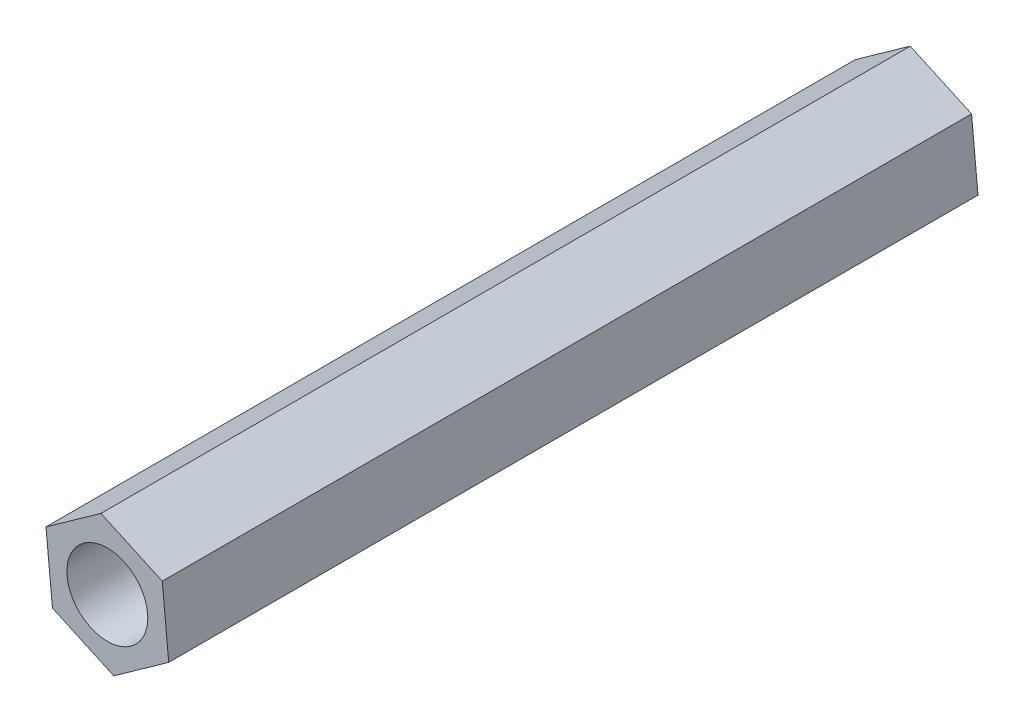
ISO-10303-21;
HEADER;
FILE_DESCRIPTION(('STEP AP214'),'2;1');
FILE_NAME('part.step','',(''),(''),'','','');
FILE_SCHEMA(('AUTOMOTIVE_DESIGN { 1 0 10303 214 1 1 1 1 }'));
ENDSEC;
DATA;
#1=APPLICATION_CONTEXT('core data for automotive mechanical design processes');
#2=APPLICATION_PROTOCOL_DEFINITION('international standard','automotive_design',2000,#1);
#3=PRODUCT_CONTEXT('',#1,'mechanical');
#4=PRODUCT('Part','Part','',(#3));
#5=PRODUCT_RELATED_PRODUCT_CATEGORY('part','',(#4));
#6=PRODUCT_DEFINITION_FORMATION('','',#4);
#7=PRODUCT_DEFINITION_CONTEXT('part definition',#1,'design');
#8=PRODUCT_DEFINITION('design','',#6,#7);
#9=PRODUCT_DEFINITION_SHAPE('','',#8);
#10=(LENGTH_UNIT() NAMED_UNIT(*) SI_UNIT(.MILLI.,.METRE.));
#11=(NAMED_UNIT(*) PLANE_ANGLE_UNIT() SI_UNIT($,.RADIAN.));
#12=(NAMED_UNIT(*) SI_UNIT($,.STERADIAN.) SOLID_ANGLE_UNIT());
#13=UNCERTAINTY_MEASURE_WITH_UNIT(LENGTH_MEASURE(1.E-05),#10,'distance_accuracy_value','');
#14=(GEOMETRIC_REPRESENTATION_CONTEXT(3) GLOBAL_UNCERTAINTY_ASSIGNED_CONTEXT((#13)) GLOBAL_UNIT_ASSIGNED_CONTEXT((#10,
#11,#12)) REPRESENTATION_CONTEXT('',''));
#15=CARTESIAN_POINT('',(0.,0.,0.));
#16=DIRECTION('',(0.,0.,1.));
#17=DIRECTION('',(1.,0.,0.));
#18=AXIS2_PLACEMENT_3D('',#15,#16,#17);
#19=CARTESIAN_POINT('',(0.,0.,30.));
#20=DIRECTION('',(0.,0.,1.));
#21=DIRECTION('',(1.,0.,0.));
#22=AXIS2_PLACEMENT_3D('',#19,#20,#21);
#23=PLANE('',#22);
#24=DIRECTION('',(-0.0950721836324173,0.995470381226566,0.));
#25=VECTOR('',#24,1.);
#26=CARTESIAN_POINT('',(2.27409682668349,-1.03850066098588,30.));
#27=LINE('',#26,#25);
#28=CARTESIAN_POINT('',(2.27409682668349,-1.03850066098588,30.));
#29=VERTEX_POINT('',#28);
#30=CARTESIAN_POINT('',(2.03641636760244,1.45017529208054,30.));
#31=VERTEX_POINT('',#30);
#32=EDGE_CURVE('E146',#29,#31,#27,.T.);
#33=ORIENTED_EDGE('',*,*,#32,.T.);
#34=DIRECTION('',(-0.909638730673394,0.41540026439435,0.));
#35=VECTOR('',#34,1.);
#36=CARTESIAN_POINT('',(2.03641636760244,1.45017529208054,30.));
#37=LINE('',#36,#35);
#38=CARTESIAN_POINT('',(-0.237680459081043,2.48867595306641,30.));
#39=VERTEX_POINT('',#38);
#40=EDGE_CURVE('E94',#31,#39,#37,.T.);
#41=ORIENTED_EDGE('',*,*,#40,.T.);
#42=DIRECTION('',(-0.814566547040977,-0.580070116832216,0.));
#43=VECTOR('',#42,1.);
#44=CARTESIAN_POINT('',(-0.237680459081043,2.48867595306641,30.));
#45=LINE('',#44,#43);
#46=CARTESIAN_POINT('',(-2.27409682668349,1.03850066098588,30.));
#47=VERTEX_POINT('',#46);
#48=EDGE_CURVE('E107',#39,#47,#45,.T.);
#49=ORIENTED_EDGE('',*,*,#48,.T.);
#50=DIRECTION('',(0.0950721836324175,-0.995470381226566,0.));
#51=VECTOR('',#50,1.);
#52=CARTESIAN_POINT('',(-2.27409682668349,1.03850066098588,30.));
#53=LINE('',#52,#51);
#54=CARTESIAN_POINT('',(-2.03641636760244,-1.45017529208054,30.));
#55=VERTEX_POINT('',#54);
#56=EDGE_CURVE('E101',#47,#55,#53,.T.);
#57=ORIENTED_EDGE('',*,*,#56,.T.);
#58=DIRECTION('',(0.909638730673394,-0.41540026439435,0.));
#59=VECTOR('',#58,1.);
#60=CARTESIAN_POINT('',(-2.03641636760244,-1.45017529208054,30.));
#61=LINE('',#60,#59);
#62=CARTESIAN_POINT('',(0.237680459081043,-2.48867595306641,30.));
#63=VERTEX_POINT('',#62);
#64=EDGE_CURVE('E105',#55,#63,#61,.T.);
#65=ORIENTED_EDGE('',*,*,#64,.T.);
#66=DIRECTION('',(0.814566547040977,0.580070116832215,0.));
#67=VECTOR('',#66,1.);
#68=CARTESIAN_POINT('',(0.237680459081043,-2.48867595306641,30.));
#69=LINE('',#68,#67);
#70=EDGE_CURVE('E57',#63,#29,#69,.T.);
#71=ORIENTED_EDGE('',*,*,#70,.T.);
#72=EDGE_LOOP('',(#33,#41,#49,#57,#65,#71));
#73=FACE_BOUND('',#72,.T.);
#74=CARTESIAN_POINT('',(0.,0.,30.));
#75=DIRECTION('',(0.,0.,1.));
#76=DIRECTION('',(1.,0.,0.));
#77=AXIS2_PLACEMENT_3D('',#74,#75,#76);
#78=CIRCLE('',#77,1.5);
#79=CARTESIAN_POINT('',(1.5,0.,30.));
#80=VERTEX_POINT('',#79);
#81=EDGE_CURVE('E134',#80,#80,#78,.T.);
#82=ORIENTED_EDGE('',*,*,#81,.F.);
#83=EDGE_LOOP('',(#82));
#84=FACE_BOUND('',#83,.T.);
#85=ADVANCED_FACE('F39',(#73,#84),#23,.T.);
#86=CARTESIAN_POINT('',(0.,0.,0.));
#87=DIRECTION('',(0.,0.,1.));
#88=DIRECTION('',(1.,0.,0.));
#89=AXIS2_PLACEMENT_3D('',#86,#87,#88);
#90=PLANE('',#89);
#91=DIRECTION('',(-0.0950721836324173,0.995470381226566,0.));
#92=VECTOR('',#91,1.);
#93=CARTESIAN_POINT('',(2.27409682668349,-1.03850066098588,0.));
#94=LINE('',#93,#92);
#95=CARTESIAN_POINT('',(2.27409682668349,-1.03850066098588,0.));
#96=VERTEX_POINT('',#95);
#97=CARTESIAN_POINT('',(2.03641636760244,1.45017529208054,0.));
#98=VERTEX_POINT('',#97);
#99=EDGE_CURVE('E129',#96,#98,#94,.T.);
#100=ORIENTED_EDGE('',*,*,#99,.F.);
#101=DIRECTION('',(0.814566547040977,0.580070116832215,0.));
#102=VECTOR('',#101,1.);
#103=CARTESIAN_POINT('',(0.237680459081043,-2.48867595306641,0.));
#104=LINE('',#103,#102);
#105=CARTESIAN_POINT('',(0.237680459081043,-2.48867595306641,0.));
#106=VERTEX_POINT('',#105);
#107=EDGE_CURVE('E86',#106,#96,#104,.T.);
#108=ORIENTED_EDGE('',*,*,#107,.F.);
#109=DIRECTION('',(0.909638730673394,-0.41540026439435,0.));
#110=VECTOR('',#109,1.);
#111=CARTESIAN_POINT('',(-2.03641636760244,-1.45017529208054,0.));
#112=LINE('',#111,#110);
#113=CARTESIAN_POINT('',(-2.03641636760244,-1.45017529208054,0.));
#114=VERTEX_POINT('',#113);
#115=EDGE_CURVE('E80',#114,#106,#112,.T.);
#116=ORIENTED_EDGE('',*,*,#115,.F.);
#117=DIRECTION('',(0.0950721836324175,-0.995470381226566,0.));
#118=VECTOR('',#117,1.);
#119=CARTESIAN_POINT('',(-2.27409682668349,1.03850066098588,0.));
#120=LINE('',#119,#118);
#121=CARTESIAN_POINT('',(-2.27409682668349,1.03850066098588,0.));
#122=VERTEX_POINT('',#121);
#123=EDGE_CURVE('E116',#122,#114,#120,.T.);
#124=ORIENTED_EDGE('',*,*,#123,.F.);
#125=DIRECTION('',(-0.814566547040977,-0.580070116832216,0.));
#126=VECTOR('',#125,1.);
#127=CARTESIAN_POINT('',(-0.237680459081043,2.48867595306641,0.));
#128=LINE('',#127,#126);
#129=CARTESIAN_POINT('',(-0.237680459081043,2.48867595306641,0.));
#130=VERTEX_POINT('',#129);
#131=EDGE_CURVE('E137',#130,#122,#128,.T.);
#132=ORIENTED_EDGE('',*,*,#131,.F.);
#133=DIRECTION('',(-0.909638730673394,0.41540026439435,0.));
#134=VECTOR('',#133,1.);
#135=CARTESIAN_POINT('',(2.03641636760244,1.45017529208054,0.));
#136=LINE('',#135,#134);
#137=EDGE_CURVE('E133',#98,#130,#136,.T.);
#138=ORIENTED_EDGE('',*,*,#137,.F.);
#139=EDGE_LOOP('',(#100,#108,#116,#124,#132,#138));
#140=FACE_BOUND('',#139,.T.);
#141=CARTESIAN_POINT('',(0.,0.,0.));
#142=DIRECTION('',(0.,0.,1.));
#143=DIRECTION('',(1.,0.,0.));
#144=AXIS2_PLACEMENT_3D('',#141,#142,#143);
#145=CIRCLE('',#144,1.5);
#146=CARTESIAN_POINT('',(1.5,0.,0.));
#147=VERTEX_POINT('',#146);
#148=EDGE_CURVE('E243',#147,#147,#145,.T.);
#149=ORIENTED_EDGE('',*,*,#148,.T.);
#150=EDGE_LOOP('',(#149));
#151=FACE_BOUND('',#150,.T.);
#152=ADVANCED_FACE('F159',(#140,#151),#90,.F.);
#153=CARTESIAN_POINT('',(2.27409682668349,-1.03850066098588,30.));
#154=DIRECTION('',(-0.995470381226566,-0.0950721836324173,0.));
#155=DIRECTION('',(0.0950721836324173,-0.995470381226566,0.));
#156=AXIS2_PLACEMENT_3D('',#153,#154,#155);
#157=PLANE('',#156);
#158=ORIENTED_EDGE('',*,*,#99,.T.);
#159=DIRECTION('',(0.,0.,-1.));
#160=VECTOR('',#159,1.);
#161=CARTESIAN_POINT('',(2.03641636760244,1.45017529208054,30.));
#162=LINE('',#161,#160);
#163=EDGE_CURVE('E11',#31,#98,#162,.T.);
#164=ORIENTED_EDGE('',*,*,#163,.F.);
#165=ORIENTED_EDGE('',*,*,#32,.F.);
#166=DIRECTION('',(0.,0.,-1.));
#167=VECTOR('',#166,1.);
#168=CARTESIAN_POINT('',(2.27409682668349,-1.03850066098588,30.));
#169=LINE('',#168,#167);
#170=EDGE_CURVE('E125',#29,#96,#169,.T.);
#171=ORIENTED_EDGE('',*,*,#170,.T.);
#172=EDGE_LOOP('',(#158,#164,#165,#171));
#173=FACE_BOUND('',#172,.T.);
#174=ADVANCED_FACE('F41',(#173),#157,.F.);
#175=CARTESIAN_POINT('',(2.03641636760244,1.45017529208054,30.));
#176=DIRECTION('',(-0.41540026439435,-0.909638730673394,0.));
#177=DIRECTION('',(0.909638730673394,-0.41540026439435,0.));
#178=AXIS2_PLACEMENT_3D('',#175,#176,#177);
#179=PLANE('',#178);
#180=ORIENTED_EDGE('',*,*,#137,.T.);
#181=DIRECTION('',(0.,0.,-1.));
#182=VECTOR('',#181,1.);
#183=CARTESIAN_POINT('',(-0.237680459081043,2.48867595306641,30.));
#184=LINE('',#183,#182);
#185=EDGE_CURVE('E49',#39,#130,#184,.T.);
#186=ORIENTED_EDGE('',*,*,#185,.F.);
#187=ORIENTED_EDGE('',*,*,#40,.F.);
#188=ORIENTED_EDGE('',*,*,#163,.T.);
#189=EDGE_LOOP('',(#180,#186,#187,#188));
#190=FACE_BOUND('',#189,.T.);
#191=ADVANCED_FACE('F184',(#190),#179,.F.);
#192=CARTESIAN_POINT('',(-0.237680459081043,2.48867595306641,30.));
#193=DIRECTION('',(0.580070116832216,-0.814566547040977,0.));
#194=DIRECTION('',(0.814566547040977,0.580070116832216,0.));
#195=AXIS2_PLACEMENT_3D('',#192,#193,#194);
#196=PLANE('',#195);
#197=ORIENTED_EDGE('',*,*,#131,.T.);
#198=DIRECTION('',(0.,0.,-1.));
#199=VECTOR('',#198,1.);
#200=CARTESIAN_POINT('',(-2.27409682668349,1.03850066098588,30.));
#201=LINE('',#200,#199);
#202=EDGE_CURVE('E118',#47,#122,#201,.T.);
#203=ORIENTED_EDGE('',*,*,#202,.F.);
#204=ORIENTED_EDGE('',*,*,#48,.F.);
#205=ORIENTED_EDGE('',*,*,#185,.T.);
#206=EDGE_LOOP('',(#197,#203,#204,#205));
#207=FACE_BOUND('',#206,.T.);
#208=ADVANCED_FACE('F156',(#207),#196,.F.);
#209=CARTESIAN_POINT('',(-2.27409682668349,1.03850066098588,30.));
#210=DIRECTION('',(0.995470381226566,0.0950721836324174,0.));
#211=DIRECTION('',(-0.0950721836324175,0.995470381226566,0.));
#212=AXIS2_PLACEMENT_3D('',#209,#210,#211);
#213=PLANE('',#212);
#214=ORIENTED_EDGE('',*,*,#123,.T.);
#215=DIRECTION('',(0.,0.,-1.));
#216=VECTOR('',#215,1.);
#217=CARTESIAN_POINT('',(-2.03641636760244,-1.45017529208054,30.));
#218=LINE('',#217,#216);
#219=EDGE_CURVE('E113',#55,#114,#218,.T.);
#220=ORIENTED_EDGE('',*,*,#219,.F.);
#221=ORIENTED_EDGE('',*,*,#56,.F.);
#222=ORIENTED_EDGE('',*,*,#202,.T.);
#223=EDGE_LOOP('',(#214,#220,#221,#222));
#224=FACE_BOUND('',#223,.T.);
#225=ADVANCED_FACE('F114',(#224),#213,.F.);
#226=CARTESIAN_POINT('',(-2.03641636760244,-1.45017529208054,30.));
#227=DIRECTION('',(0.41540026439435,0.909638730673394,0.));
#228=DIRECTION('',(-0.909638730673394,0.41540026439435,0.));
#229=AXIS2_PLACEMENT_3D('',#226,#227,#228);
#230=PLANE('',#229);
#231=ORIENTED_EDGE('',*,*,#115,.T.);
#232=DIRECTION('',(0.,0.,-1.));
#233=VECTOR('',#232,1.);
#234=CARTESIAN_POINT('',(0.237680459081043,-2.48867595306641,30.));
#235=LINE('',#234,#233);
#236=EDGE_CURVE('E119',#63,#106,#235,.T.);
#237=ORIENTED_EDGE('',*,*,#236,.F.);
#238=ORIENTED_EDGE('',*,*,#64,.F.);
#239=ORIENTED_EDGE('',*,*,#219,.T.);
#240=EDGE_LOOP('',(#231,#237,#238,#239));
#241=FACE_BOUND('',#240,.T.);
#242=ADVANCED_FACE('F121',(#241),#230,.F.);
#243=CARTESIAN_POINT('',(0.237680459081043,-2.48867595306641,30.));
#244=DIRECTION('',(-0.580070116832215,0.814566547040977,0.));
#245=DIRECTION('',(-0.814566547040977,-0.580070116832215,0.));
#246=AXIS2_PLACEMENT_3D('',#243,#244,#245);
#247=PLANE('',#246);
#248=ORIENTED_EDGE('',*,*,#107,.T.);
#249=ORIENTED_EDGE('',*,*,#170,.F.);
#250=ORIENTED_EDGE('',*,*,#70,.F.);
#251=ORIENTED_EDGE('',*,*,#236,.T.);
#252=EDGE_LOOP('',(#248,#249,#250,#251));
#253=FACE_BOUND('',#252,.T.);
#254=ADVANCED_FACE('F164',(#253),#247,.F.);
#255=CARTESIAN_POINT('',(0.,0.,30.));
#256=DIRECTION('',(0.,0.,-1.));
#257=DIRECTION('',(-1.,0.,0.));
#258=AXIS2_PLACEMENT_3D('',#255,#256,#257);
#259=CYLINDRICAL_SURFACE('',#258,1.5);
#260=ORIENTED_EDGE('',*,*,#81,.T.);
#261=EDGE_LOOP('',(#260));
#262=FACE_BOUND('',#261,.T.);
#263=ORIENTED_EDGE('',*,*,#148,.F.);
#264=EDGE_LOOP('',(#263));
#265=FACE_BOUND('',#264,.T.);
#266=ADVANCED_FACE('F166',(#262,#265),#259,.F.);
#267=CLOSED_SHELL('',(#85,#152,#174,#191,#208,#225,#242,#254,#266));
#268=MANIFOLD_SOLID_BREP('B2',#267);
#269=ADVANCED_BREP_SHAPE_REPRESENTATION('',(#18,#268),#14);
#270=SHAPE_DEFINITION_REPRESENTATION(#9,#269);
ENDSEC;
END-ISO-10303-21;
